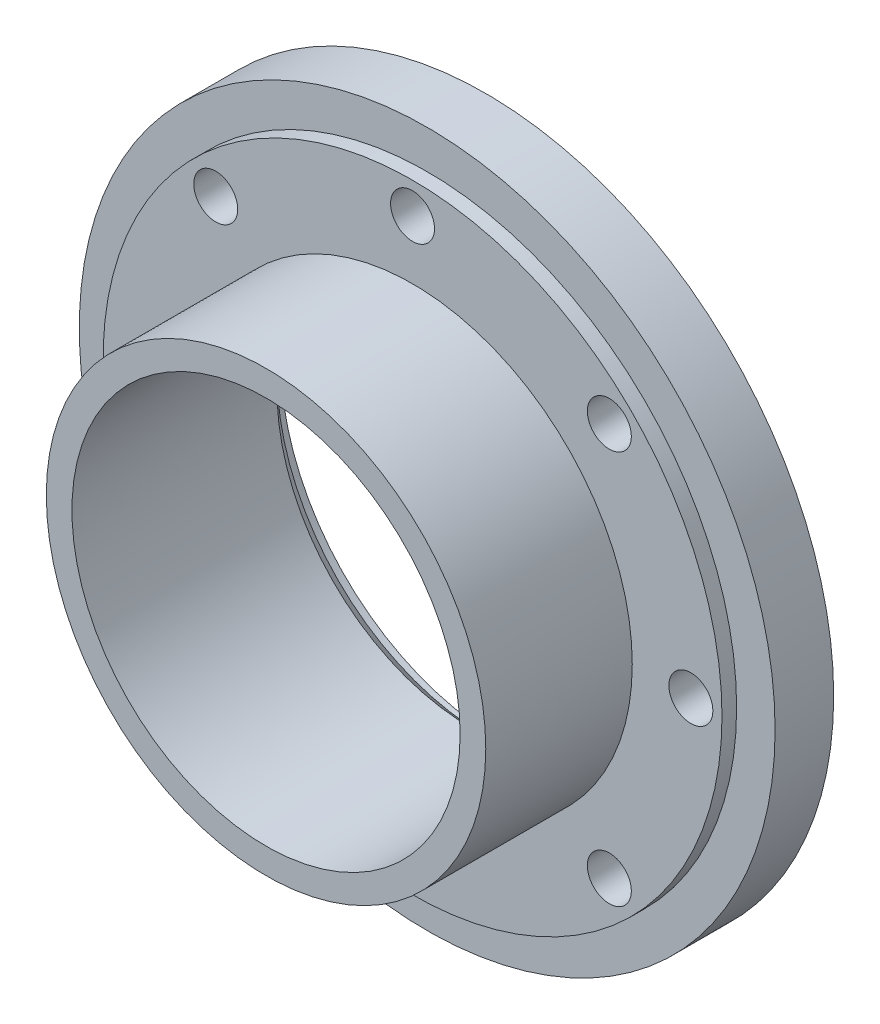
ISO-10303-21;
HEADER;
FILE_DESCRIPTION(('STEP AP214'),'2;1');
FILE_NAME('part.step','',(''),(''),'','','');
FILE_SCHEMA(('AUTOMOTIVE_DESIGN { 1 0 10303 214 1 1 1 1 }'));
ENDSEC;
DATA;
#1=APPLICATION_CONTEXT('core data for automotive mechanical design processes');
#2=APPLICATION_PROTOCOL_DEFINITION('international standard','automotive_design',2000,#1);
#3=PRODUCT_CONTEXT('',#1,'mechanical');
#4=PRODUCT('Part','Part','',(#3));
#5=PRODUCT_RELATED_PRODUCT_CATEGORY('part','',(#4));
#6=PRODUCT_DEFINITION_FORMATION('','',#4);
#7=PRODUCT_DEFINITION_CONTEXT('part definition',#1,'design');
#8=PRODUCT_DEFINITION('design','',#6,#7);
#9=PRODUCT_DEFINITION_SHAPE('','',#8);
#10=(LENGTH_UNIT() NAMED_UNIT(*) SI_UNIT(.MILLI.,.METRE.));
#11=(NAMED_UNIT(*) PLANE_ANGLE_UNIT() SI_UNIT($,.RADIAN.));
#12=(NAMED_UNIT(*) SI_UNIT($,.STERADIAN.) SOLID_ANGLE_UNIT());
#13=UNCERTAINTY_MEASURE_WITH_UNIT(LENGTH_MEASURE(1.E-05),#10,'distance_accuracy_value','');
#14=(GEOMETRIC_REPRESENTATION_CONTEXT(3) GLOBAL_UNCERTAINTY_ASSIGNED_CONTEXT((#13)) GLOBAL_UNIT_ASSIGNED_CONTEXT((#10,
#11,#12)) REPRESENTATION_CONTEXT('',''));
#15=CARTESIAN_POINT('',(0.,0.,0.));
#16=DIRECTION('',(0.,0.,1.));
#17=DIRECTION('',(1.,0.,0.));
#18=AXIS2_PLACEMENT_3D('',#15,#16,#17);
#19=CARTESIAN_POINT('',(0.,0.,10.));
#20=DIRECTION('',(0.,0.,1.));
#21=DIRECTION('',(1.,0.,0.));
#22=AXIS2_PLACEMENT_3D('',#19,#20,#21);
#23=PLANE('',#22);
#24=CARTESIAN_POINT('',(-26.8700576850888,26.8700576850888,10.));
#25=DIRECTION('',(0.,0.,1.));
#26=DIRECTION('',(1.,0.,0.));
#27=AXIS2_PLACEMENT_3D('',#24,#25,#26);
#28=CIRCLE('',#27,3.);
#29=CARTESIAN_POINT('',(-23.8700576850888,26.8700576850888,10.));
#30=VERTEX_POINT('',#29);
#31=EDGE_CURVE('E125',#30,#30,#28,.T.);
#32=ORIENTED_EDGE('',*,*,#31,.F.);
#33=EDGE_LOOP('',(#32));
#34=FACE_BOUND('',#33,.T.);
#35=CARTESIAN_POINT('',(-38.,0.,10.));
#36=DIRECTION('',(0.,0.,1.));
#37=DIRECTION('',(1.,0.,0.));
#38=AXIS2_PLACEMENT_3D('',#35,#36,#37);
#39=CIRCLE('',#38,3.);
#40=CARTESIAN_POINT('',(-35.,0.,10.));
#41=VERTEX_POINT('',#40);
#42=EDGE_CURVE('E119',#41,#41,#39,.T.);
#43=ORIENTED_EDGE('',*,*,#42,.F.);
#44=EDGE_LOOP('',(#43));
#45=FACE_BOUND('',#44,.T.);
#46=CARTESIAN_POINT('',(-26.8700576850888,-26.8700576850888,10.));
#47=DIRECTION('',(0.,0.,1.));
#48=DIRECTION('',(1.,0.,0.));
#49=AXIS2_PLACEMENT_3D('',#46,#47,#48);
#50=CIRCLE('',#49,3.);
#51=CARTESIAN_POINT('',(-23.8700576850888,-26.8700576850888,10.));
#52=VERTEX_POINT('',#51);
#53=EDGE_CURVE('E113',#52,#52,#50,.T.);
#54=ORIENTED_EDGE('',*,*,#53,.F.);
#55=EDGE_LOOP('',(#54));
#56=FACE_BOUND('',#55,.T.);
#57=CARTESIAN_POINT('',(0.,-38.,10.));
#58=DIRECTION('',(0.,0.,1.));
#59=DIRECTION('',(1.,0.,0.));
#60=AXIS2_PLACEMENT_3D('',#57,#58,#59);
#61=CIRCLE('',#60,3.);
#62=CARTESIAN_POINT('',(3.00000000000001,-38.,10.));
#63=VERTEX_POINT('',#62);
#64=EDGE_CURVE('E107',#63,#63,#61,.T.);
#65=ORIENTED_EDGE('',*,*,#64,.F.);
#66=EDGE_LOOP('',(#65));
#67=FACE_BOUND('',#66,.T.);
#68=CARTESIAN_POINT('',(26.8700576850888,-26.8700576850888,10.));
#69=DIRECTION('',(0.,0.,1.));
#70=DIRECTION('',(1.,0.,0.));
#71=AXIS2_PLACEMENT_3D('',#68,#69,#70);
#72=CIRCLE('',#71,3.);
#73=CARTESIAN_POINT('',(29.8700576850888,-26.8700576850888,10.));
#74=VERTEX_POINT('',#73);
#75=EDGE_CURVE('E101',#74,#74,#72,.T.);
#76=ORIENTED_EDGE('',*,*,#75,.F.);
#77=EDGE_LOOP('',(#76));
#78=FACE_BOUND('',#77,.T.);
#79=CARTESIAN_POINT('',(38.,0.,10.));
#80=DIRECTION('',(0.,0.,1.));
#81=DIRECTION('',(1.,0.,0.));
#82=AXIS2_PLACEMENT_3D('',#79,#80,#81);
#83=CIRCLE('',#82,3.);
#84=CARTESIAN_POINT('',(41.,0.,10.));
#85=VERTEX_POINT('',#84);
#86=EDGE_CURVE('E95',#85,#85,#83,.T.);
#87=ORIENTED_EDGE('',*,*,#86,.F.);
#88=EDGE_LOOP('',(#87));
#89=FACE_BOUND('',#88,.T.);
#90=CARTESIAN_POINT('',(26.8700576850888,26.8700576850888,10.));
#91=DIRECTION('',(0.,0.,1.));
#92=DIRECTION('',(1.,0.,0.));
#93=AXIS2_PLACEMENT_3D('',#90,#91,#92);
#94=CIRCLE('',#93,3.);
#95=CARTESIAN_POINT('',(29.8700576850888,26.8700576850888,10.));
#96=VERTEX_POINT('',#95);
#97=EDGE_CURVE('E89',#96,#96,#94,.T.);
#98=ORIENTED_EDGE('',*,*,#97,.F.);
#99=EDGE_LOOP('',(#98));
#100=FACE_BOUND('',#99,.T.);
#101=CARTESIAN_POINT('',(0.,38.,10.));
#102=DIRECTION('',(0.,0.,1.));
#103=DIRECTION('',(1.,0.,0.));
#104=AXIS2_PLACEMENT_3D('',#101,#102,#103);
#105=CIRCLE('',#104,3.);
#106=CARTESIAN_POINT('',(3.,38.,10.));
#107=VERTEX_POINT('',#106);
#108=EDGE_CURVE('E83',#107,#107,#105,.T.);
#109=ORIENTED_EDGE('',*,*,#108,.F.);
#110=EDGE_LOOP('',(#109));
#111=FACE_BOUND('',#110,.T.);
#112=CARTESIAN_POINT('',(0.,0.,10.));
#113=DIRECTION('',(0.,0.,1.));
#114=DIRECTION('',(1.,0.,0.));
#115=AXIS2_PLACEMENT_3D('',#112,#113,#114);
#116=CIRCLE('',#115,30.);
#117=CARTESIAN_POINT('',(30.,0.,10.));
#118=VERTEX_POINT('',#117);
#119=EDGE_CURVE('E56',#118,#118,#116,.T.);
#120=ORIENTED_EDGE('',*,*,#119,.F.);
#121=EDGE_LOOP('',(#120));
#122=FACE_BOUND('',#121,.T.);
#123=CARTESIAN_POINT('',(0.,0.,10.));
#124=DIRECTION('',(0.,0.,1.));
#125=DIRECTION('',(1.,0.,0.));
#126=AXIS2_PLACEMENT_3D('',#123,#124,#125);
#127=CIRCLE('',#126,42.25);
#128=CARTESIAN_POINT('',(42.25,0.,10.));
#129=VERTEX_POINT('',#128);
#130=EDGE_CURVE('E77',#129,#129,#127,.T.);
#131=ORIENTED_EDGE('',*,*,#130,.T.);
#132=EDGE_LOOP('',(#131));
#133=FACE_BOUND('',#132,.T.);
#134=ADVANCED_FACE('F35',(#34,#45,#56,#67,#78,#89,#100,#111,#122,#133),#23,.T.);
#135=CARTESIAN_POINT('',(0.,0.,10.));
#136=DIRECTION('',(0.,0.,-1.));
#137=DIRECTION('',(-1.,0.,0.));
#138=AXIS2_PLACEMENT_3D('',#135,#136,#137);
#139=CYLINDRICAL_SURFACE('',#138,47.5);
#140=CARTESIAN_POINT('',(0.,0.,0.));
#141=DIRECTION('',(0.,0.,1.));
#142=DIRECTION('',(1.,0.,0.));
#143=AXIS2_PLACEMENT_3D('',#140,#141,#142);
#144=CIRCLE('',#143,47.5);
#145=CARTESIAN_POINT('',(47.5,0.,0.));
#146=VERTEX_POINT('',#145);
#147=EDGE_CURVE('E50',#146,#146,#144,.T.);
#148=ORIENTED_EDGE('',*,*,#147,.T.);
#149=EDGE_LOOP('',(#148));
#150=FACE_BOUND('',#149,.T.);
#151=CARTESIAN_POINT('',(0.,0.,8.));
#152=DIRECTION('',(0.,0.,1.));
#153=DIRECTION('',(1.,0.,0.));
#154=AXIS2_PLACEMENT_3D('',#151,#152,#153);
#155=CIRCLE('',#154,47.5);
#156=CARTESIAN_POINT('',(47.5,0.,8.));
#157=VERTEX_POINT('',#156);
#158=EDGE_CURVE('E71',#157,#157,#155,.T.);
#159=ORIENTED_EDGE('',*,*,#158,.F.);
#160=EDGE_LOOP('',(#159));
#161=FACE_BOUND('',#160,.T.);
#162=ADVANCED_FACE('F143',(#150,#161),#139,.T.);
#163=CARTESIAN_POINT('',(0.,0.,0.));
#164=DIRECTION('',(0.,0.,1.));
#165=DIRECTION('',(1.,0.,0.));
#166=AXIS2_PLACEMENT_3D('',#163,#164,#165);
#167=PLANE('',#166);
#168=CARTESIAN_POINT('',(-26.8700576850888,26.8700576850888,0.));
#169=DIRECTION('',(0.,0.,1.));
#170=DIRECTION('',(1.,0.,0.));
#171=AXIS2_PLACEMENT_3D('',#168,#169,#170);
#172=CIRCLE('',#171,3.);
#173=CARTESIAN_POINT('',(-23.8700576850888,26.8700576850888,0.));
#174=VERTEX_POINT('',#173);
#175=EDGE_CURVE('E122',#174,#174,#172,.T.);
#176=ORIENTED_EDGE('',*,*,#175,.T.);
#177=EDGE_LOOP('',(#176));
#178=FACE_BOUND('',#177,.T.);
#179=CARTESIAN_POINT('',(-38.,0.,0.));
#180=DIRECTION('',(0.,0.,1.));
#181=DIRECTION('',(1.,0.,0.));
#182=AXIS2_PLACEMENT_3D('',#179,#180,#181);
#183=CIRCLE('',#182,3.);
#184=CARTESIAN_POINT('',(-35.,0.,0.));
#185=VERTEX_POINT('',#184);
#186=EDGE_CURVE('E116',#185,#185,#183,.T.);
#187=ORIENTED_EDGE('',*,*,#186,.T.);
#188=EDGE_LOOP('',(#187));
#189=FACE_BOUND('',#188,.T.);
#190=CARTESIAN_POINT('',(-26.8700576850888,-26.8700576850888,0.));
#191=DIRECTION('',(0.,0.,1.));
#192=DIRECTION('',(1.,0.,0.));
#193=AXIS2_PLACEMENT_3D('',#190,#191,#192);
#194=CIRCLE('',#193,3.);
#195=CARTESIAN_POINT('',(-23.8700576850888,-26.8700576850888,0.));
#196=VERTEX_POINT('',#195);
#197=EDGE_CURVE('E110',#196,#196,#194,.T.);
#198=ORIENTED_EDGE('',*,*,#197,.T.);
#199=EDGE_LOOP('',(#198));
#200=FACE_BOUND('',#199,.T.);
#201=CARTESIAN_POINT('',(0.,-38.,0.));
#202=DIRECTION('',(0.,0.,1.));
#203=DIRECTION('',(1.,0.,0.));
#204=AXIS2_PLACEMENT_3D('',#201,#202,#203);
#205=CIRCLE('',#204,3.);
#206=CARTESIAN_POINT('',(3.00000000000001,-38.,0.));
#207=VERTEX_POINT('',#206);
#208=EDGE_CURVE('E104',#207,#207,#205,.T.);
#209=ORIENTED_EDGE('',*,*,#208,.T.);
#210=EDGE_LOOP('',(#209));
#211=FACE_BOUND('',#210,.T.);
#212=CARTESIAN_POINT('',(26.8700576850888,-26.8700576850888,0.));
#213=DIRECTION('',(0.,0.,1.));
#214=DIRECTION('',(1.,0.,0.));
#215=AXIS2_PLACEMENT_3D('',#212,#213,#214);
#216=CIRCLE('',#215,3.);
#217=CARTESIAN_POINT('',(29.8700576850888,-26.8700576850888,0.));
#218=VERTEX_POINT('',#217);
#219=EDGE_CURVE('E98',#218,#218,#216,.T.);
#220=ORIENTED_EDGE('',*,*,#219,.T.);
#221=EDGE_LOOP('',(#220));
#222=FACE_BOUND('',#221,.T.);
#223=CARTESIAN_POINT('',(38.,0.,0.));
#224=DIRECTION('',(0.,0.,1.));
#225=DIRECTION('',(1.,0.,0.));
#226=AXIS2_PLACEMENT_3D('',#223,#224,#225);
#227=CIRCLE('',#226,3.);
#228=CARTESIAN_POINT('',(41.,0.,0.));
#229=VERTEX_POINT('',#228);
#230=EDGE_CURVE('E92',#229,#229,#227,.T.);
#231=ORIENTED_EDGE('',*,*,#230,.T.);
#232=EDGE_LOOP('',(#231));
#233=FACE_BOUND('',#232,.T.);
#234=CARTESIAN_POINT('',(26.8700576850888,26.8700576850888,0.));
#235=DIRECTION('',(0.,0.,1.));
#236=DIRECTION('',(1.,0.,0.));
#237=AXIS2_PLACEMENT_3D('',#234,#235,#236);
#238=CIRCLE('',#237,3.);
#239=CARTESIAN_POINT('',(29.8700576850888,26.8700576850888,0.));
#240=VERTEX_POINT('',#239);
#241=EDGE_CURVE('E86',#240,#240,#238,.T.);
#242=ORIENTED_EDGE('',*,*,#241,.T.);
#243=EDGE_LOOP('',(#242));
#244=FACE_BOUND('',#243,.T.);
#245=CARTESIAN_POINT('',(0.,38.,0.));
#246=DIRECTION('',(0.,0.,1.));
#247=DIRECTION('',(1.,0.,0.));
#248=AXIS2_PLACEMENT_3D('',#245,#246,#247);
#249=CIRCLE('',#248,3.);
#250=CARTESIAN_POINT('',(3.,38.,0.));
#251=VERTEX_POINT('',#250);
#252=EDGE_CURVE('E80',#251,#251,#249,.T.);
#253=ORIENTED_EDGE('',*,*,#252,.T.);
#254=EDGE_LOOP('',(#253));
#255=FACE_BOUND('',#254,.T.);
#256=ORIENTED_EDGE('',*,*,#147,.F.);
#257=EDGE_LOOP('',(#256));
#258=FACE_BOUND('',#257,.T.);
#259=CARTESIAN_POINT('',(0.,0.,0.));
#260=DIRECTION('',(0.,0.,1.));
#261=DIRECTION('',(1.,0.,0.));
#262=AXIS2_PLACEMENT_3D('',#259,#260,#261);
#263=CIRCLE('',#262,34.);
#264=CARTESIAN_POINT('',(34.,0.,0.));
#265=VERTEX_POINT('',#264);
#266=EDGE_CURVE('E46',#265,#265,#263,.F.);
#267=ORIENTED_EDGE('',*,*,#266,.F.);
#268=EDGE_LOOP('',(#267));
#269=FACE_BOUND('',#268,.T.);
#270=ADVANCED_FACE('F131',(#178,#189,#200,#211,#222,#233,#244,#255,#258,#269),#167,.F.);
#271=CARTESIAN_POINT('',(0.,0.,0.));
#272=DIRECTION('',(0.,0.,1.));
#273=DIRECTION('',(1.,0.,0.));
#274=AXIS2_PLACEMENT_3D('',#271,#272,#273);
#275=CIRCLE('',#274,28.5);
#276=CARTESIAN_POINT('',(28.5,0.,0.));
#277=VERTEX_POINT('',#276);
#278=EDGE_CURVE('E42',#277,#277,#275,.T.);
#279=ORIENTED_EDGE('',*,*,#278,.T.);
#280=EDGE_LOOP('',(#279));
#281=FACE_BOUND('',#280,.T.);
#282=CARTESIAN_POINT('',(0.,0.,0.));
#283=DIRECTION('',(0.,0.,-1.));
#284=DIRECTION('',(-1.,0.,0.));
#285=AXIS2_PLACEMENT_3D('',#282,#283,#284);
#286=CIRCLE('',#285,30.);
#287=CARTESIAN_POINT('',(-30.,0.,0.));
#288=VERTEX_POINT('',#287);
#289=EDGE_CURVE('E68',#288,#288,#286,.T.);
#290=ORIENTED_EDGE('',*,*,#289,.T.);
#291=EDGE_LOOP('',(#290));
#292=FACE_BOUND('',#291,.T.);
#293=ADVANCED_FACE('F201',(#281,#292),#167,.F.);
#294=CARTESIAN_POINT('',(0.,0.,30.));
#295=DIRECTION('',(0.,0.,-1.));
#296=DIRECTION('',(-1.,0.,0.));
#297=AXIS2_PLACEMENT_3D('',#294,#295,#296);
#298=CYLINDRICAL_SURFACE('',#297,30.);
#299=CARTESIAN_POINT('',(0.,0.,30.));
#300=DIRECTION('',(0.,0.,1.));
#301=DIRECTION('',(1.,0.,0.));
#302=AXIS2_PLACEMENT_3D('',#299,#300,#301);
#303=CIRCLE('',#302,30.);
#304=CARTESIAN_POINT('',(30.,0.,30.));
#305=VERTEX_POINT('',#304);
#306=EDGE_CURVE('E55',#305,#305,#303,.T.);
#307=ORIENTED_EDGE('',*,*,#306,.F.);
#308=EDGE_LOOP('',(#307));
#309=FACE_BOUND('',#308,.T.);
#310=ORIENTED_EDGE('',*,*,#119,.T.);
#311=EDGE_LOOP('',(#310));
#312=FACE_BOUND('',#311,.T.);
#313=ADVANCED_FACE('F198',(#309,#312),#298,.T.);
#314=CARTESIAN_POINT('',(0.,0.,30.));
#315=DIRECTION('',(0.,0.,1.));
#316=DIRECTION('',(1.,0.,0.));
#317=AXIS2_PLACEMENT_3D('',#314,#315,#316);
#318=PLANE('',#317);
#319=CARTESIAN_POINT('',(0.,0.,30.));
#320=DIRECTION('',(0.,0.,1.));
#321=DIRECTION('',(1.,0.,0.));
#322=AXIS2_PLACEMENT_3D('',#319,#320,#321);
#323=CIRCLE('',#322,26.5);
#324=CARTESIAN_POINT('',(26.5,0.,30.));
#325=VERTEX_POINT('',#324);
#326=EDGE_CURVE('E59',#325,#325,#323,.T.);
#327=ORIENTED_EDGE('',*,*,#326,.F.);
#328=EDGE_LOOP('',(#327));
#329=FACE_BOUND('',#328,.T.);
#330=ORIENTED_EDGE('',*,*,#306,.T.);
#331=EDGE_LOOP('',(#330));
#332=FACE_BOUND('',#331,.T.);
#333=ADVANCED_FACE('F195',(#329,#332),#318,.T.);
#334=CARTESIAN_POINT('',(0.,0.,-10.));
#335=DIRECTION('',(0.,0.,1.));
#336=DIRECTION('',(1.,0.,0.));
#337=AXIS2_PLACEMENT_3D('',#334,#335,#336);
#338=CYLINDRICAL_SURFACE('',#337,26.5);
#339=CARTESIAN_POINT('',(0.,0.,1.99999999999999));
#340=DIRECTION('',(0.,0.,1.));
#341=DIRECTION('',(1.,0.,0.));
#342=AXIS2_PLACEMENT_3D('',#339,#340,#341);
#343=CIRCLE('',#342,26.5);
#344=CARTESIAN_POINT('',(26.5,0.,1.99999999999999));
#345=VERTEX_POINT('',#344);
#346=EDGE_CURVE('E10',#345,#345,#343,.F.);
#347=ORIENTED_EDGE('',*,*,#346,.T.);
#348=EDGE_LOOP('',(#347));
#349=FACE_BOUND('',#348,.T.);
#350=ORIENTED_EDGE('',*,*,#326,.T.);
#351=EDGE_LOOP('',(#350));
#352=FACE_BOUND('',#351,.T.);
#353=ADVANCED_FACE('F188',(#349,#352),#338,.F.);
#354=CARTESIAN_POINT('',(0.,0.,-2.));
#355=DIRECTION('',(0.,0.,-1.));
#356=DIRECTION('',(-1.,0.,0.));
#357=AXIS2_PLACEMENT_3D('',#354,#355,#356);
#358=PLANE('',#357);
#359=CARTESIAN_POINT('',(0.,0.,-2.));
#360=DIRECTION('',(0.,0.,-1.));
#361=DIRECTION('',(-1.,0.,0.));
#362=AXIS2_PLACEMENT_3D('',#359,#360,#361);
#363=CIRCLE('',#362,34.);
#364=CARTESIAN_POINT('',(-34.,0.,-2.));
#365=VERTEX_POINT('',#364);
#366=EDGE_CURVE('E64',#365,#365,#363,.T.);
#367=ORIENTED_EDGE('',*,*,#366,.T.);
#368=EDGE_LOOP('',(#367));
#369=FACE_BOUND('',#368,.T.);
#370=CARTESIAN_POINT('',(0.,0.,-2.));
#371=DIRECTION('',(0.,0.,-1.));
#372=DIRECTION('',(-1.,0.,0.));
#373=AXIS2_PLACEMENT_3D('',#370,#371,#372);
#374=CIRCLE('',#373,30.);
#375=CARTESIAN_POINT('',(-30.,0.,-2.));
#376=VERTEX_POINT('',#375);
#377=EDGE_CURVE('E67',#376,#376,#374,.T.);
#378=ORIENTED_EDGE('',*,*,#377,.F.);
#379=EDGE_LOOP('',(#378));
#380=FACE_BOUND('',#379,.T.);
#381=ADVANCED_FACE('F185',(#369,#380),#358,.T.);
#382=CARTESIAN_POINT('',(0.,0.,-2.));
#383=DIRECTION('',(0.,0.,1.));
#384=DIRECTION('',(1.,0.,0.));
#385=AXIS2_PLACEMENT_3D('',#382,#383,#384);
#386=CYLINDRICAL_SURFACE('',#385,34.);
#387=ORIENTED_EDGE('',*,*,#366,.F.);
#388=EDGE_LOOP('',(#387));
#389=FACE_BOUND('',#388,.T.);
#390=ORIENTED_EDGE('',*,*,#266,.T.);
#391=EDGE_LOOP('',(#390));
#392=FACE_BOUND('',#391,.T.);
#393=ADVANCED_FACE('F183',(#389,#392),#386,.T.);
#394=CARTESIAN_POINT('',(0.,0.,-2.));
#395=DIRECTION('',(0.,0.,1.));
#396=DIRECTION('',(1.,0.,0.));
#397=AXIS2_PLACEMENT_3D('',#394,#395,#396);
#398=CYLINDRICAL_SURFACE('',#397,30.);
#399=ORIENTED_EDGE('',*,*,#377,.T.);
#400=EDGE_LOOP('',(#399));
#401=FACE_BOUND('',#400,.T.);
#402=ORIENTED_EDGE('',*,*,#289,.F.);
#403=EDGE_LOOP('',(#402));
#404=FACE_BOUND('',#403,.T.);
#405=ADVANCED_FACE('F176',(#401,#404),#398,.F.);
#406=CARTESIAN_POINT('',(0.,0.,8.));
#407=DIRECTION('',(0.,0.,1.));
#408=DIRECTION('',(1.,0.,0.));
#409=AXIS2_PLACEMENT_3D('',#406,#407,#408);
#410=PLANE('',#409);
#411=CARTESIAN_POINT('',(0.,0.,8.));
#412=DIRECTION('',(0.,0.,1.));
#413=DIRECTION('',(1.,0.,0.));
#414=AXIS2_PLACEMENT_3D('',#411,#412,#413);
#415=CIRCLE('',#414,42.25);
#416=CARTESIAN_POINT('',(42.25,0.,8.));
#417=VERTEX_POINT('',#416);
#418=EDGE_CURVE('E76',#417,#417,#415,.T.);
#419=ORIENTED_EDGE('',*,*,#418,.F.);
#420=EDGE_LOOP('',(#419));
#421=FACE_BOUND('',#420,.T.);
#422=ORIENTED_EDGE('',*,*,#158,.T.);
#423=EDGE_LOOP('',(#422));
#424=FACE_BOUND('',#423,.T.);
#425=ADVANCED_FACE('F166',(#421,#424),#410,.T.);
#426=CARTESIAN_POINT('',(0.,0.,8.));
#427=DIRECTION('',(0.,0.,1.));
#428=DIRECTION('',(1.,0.,0.));
#429=AXIS2_PLACEMENT_3D('',#426,#427,#428);
#430=CYLINDRICAL_SURFACE('',#429,42.25);
#431=ORIENTED_EDGE('',*,*,#418,.T.);
#432=EDGE_LOOP('',(#431));
#433=FACE_BOUND('',#432,.T.);
#434=ORIENTED_EDGE('',*,*,#130,.F.);
#435=EDGE_LOOP('',(#434));
#436=FACE_BOUND('',#435,.T.);
#437=ADVANCED_FACE('F163',(#433,#436),#430,.T.);
#438=CARTESIAN_POINT('',(0.,38.,0.));
#439=DIRECTION('',(0.,0.,1.));
#440=DIRECTION('',(1.,0.,0.));
#441=AXIS2_PLACEMENT_3D('',#438,#439,#440);
#442=CYLINDRICAL_SURFACE('',#441,3.);
#443=ORIENTED_EDGE('',*,*,#252,.F.);
#444=EDGE_LOOP('',(#443));
#445=FACE_BOUND('',#444,.T.);
#446=ORIENTED_EDGE('',*,*,#108,.T.);
#447=EDGE_LOOP('',(#446));
#448=FACE_BOUND('',#447,.T.);
#449=ADVANCED_FACE('F165',(#445,#448),#442,.F.);
#450=CARTESIAN_POINT('',(26.8700576850888,26.8700576850888,0.));
#451=DIRECTION('',(0.,0.,1.));
#452=DIRECTION('',(1.,0.,0.));
#453=AXIS2_PLACEMENT_3D('',#450,#451,#452);
#454=CYLINDRICAL_SURFACE('',#453,3.);
#455=ORIENTED_EDGE('',*,*,#241,.F.);
#456=EDGE_LOOP('',(#455));
#457=FACE_BOUND('',#456,.T.);
#458=ORIENTED_EDGE('',*,*,#97,.T.);
#459=EDGE_LOOP('',(#458));
#460=FACE_BOUND('',#459,.T.);
#461=ADVANCED_FACE('F173',(#457,#460),#454,.F.);
#462=CARTESIAN_POINT('',(38.,0.,0.));
#463=DIRECTION('',(0.,0.,1.));
#464=DIRECTION('',(1.,0.,0.));
#465=AXIS2_PLACEMENT_3D('',#462,#463,#464);
#466=CYLINDRICAL_SURFACE('',#465,3.);
#467=ORIENTED_EDGE('',*,*,#230,.F.);
#468=EDGE_LOOP('',(#467));
#469=FACE_BOUND('',#468,.T.);
#470=ORIENTED_EDGE('',*,*,#86,.T.);
#471=EDGE_LOOP('',(#470));
#472=FACE_BOUND('',#471,.T.);
#473=ADVANCED_FACE('F299',(#469,#472),#466,.F.);
#474=CARTESIAN_POINT('',(26.8700576850888,-26.8700576850888,0.));
#475=DIRECTION('',(0.,0.,1.));
#476=DIRECTION('',(1.,0.,0.));
#477=AXIS2_PLACEMENT_3D('',#474,#475,#476);
#478=CYLINDRICAL_SURFACE('',#477,3.);
#479=ORIENTED_EDGE('',*,*,#219,.F.);
#480=EDGE_LOOP('',(#479));
#481=FACE_BOUND('',#480,.T.);
#482=ORIENTED_EDGE('',*,*,#75,.T.);
#483=EDGE_LOOP('',(#482));
#484=FACE_BOUND('',#483,.T.);
#485=ADVANCED_FACE('F307',(#481,#484),#478,.F.);
#486=CARTESIAN_POINT('',(0.,-38.,0.));
#487=DIRECTION('',(0.,0.,1.));
#488=DIRECTION('',(1.,0.,0.));
#489=AXIS2_PLACEMENT_3D('',#486,#487,#488);
#490=CYLINDRICAL_SURFACE('',#489,3.);
#491=ORIENTED_EDGE('',*,*,#208,.F.);
#492=EDGE_LOOP('',(#491));
#493=FACE_BOUND('',#492,.T.);
#494=ORIENTED_EDGE('',*,*,#64,.T.);
#495=EDGE_LOOP('',(#494));
#496=FACE_BOUND('',#495,.T.);
#497=ADVANCED_FACE('F316',(#493,#496),#490,.F.);
#498=CARTESIAN_POINT('',(-26.8700576850888,-26.8700576850888,0.));
#499=DIRECTION('',(0.,0.,1.));
#500=DIRECTION('',(1.,0.,0.));
#501=AXIS2_PLACEMENT_3D('',#498,#499,#500);
#502=CYLINDRICAL_SURFACE('',#501,3.);
#503=ORIENTED_EDGE('',*,*,#197,.F.);
#504=EDGE_LOOP('',(#503));
#505=FACE_BOUND('',#504,.T.);
#506=ORIENTED_EDGE('',*,*,#53,.T.);
#507=EDGE_LOOP('',(#506));
#508=FACE_BOUND('',#507,.T.);
#509=ADVANCED_FACE('F325',(#505,#508),#502,.F.);
#510=CARTESIAN_POINT('',(-38.,0.,0.));
#511=DIRECTION('',(0.,0.,1.));
#512=DIRECTION('',(1.,0.,0.));
#513=AXIS2_PLACEMENT_3D('',#510,#511,#512);
#514=CYLINDRICAL_SURFACE('',#513,3.);
#515=ORIENTED_EDGE('',*,*,#186,.F.);
#516=EDGE_LOOP('',(#515));
#517=FACE_BOUND('',#516,.T.);
#518=ORIENTED_EDGE('',*,*,#42,.T.);
#519=EDGE_LOOP('',(#518));
#520=FACE_BOUND('',#519,.T.);
#521=ADVANCED_FACE('F137',(#517,#520),#514,.F.);
#522=CARTESIAN_POINT('',(-26.8700576850888,26.8700576850888,0.));
#523=DIRECTION('',(0.,0.,1.));
#524=DIRECTION('',(1.,0.,0.));
#525=AXIS2_PLACEMENT_3D('',#522,#523,#524);
#526=CYLINDRICAL_SURFACE('',#525,3.);
#527=ORIENTED_EDGE('',*,*,#175,.F.);
#528=EDGE_LOOP('',(#527));
#529=FACE_BOUND('',#528,.T.);
#530=ORIENTED_EDGE('',*,*,#31,.T.);
#531=EDGE_LOOP('',(#530));
#532=FACE_BOUND('',#531,.T.);
#533=ADVANCED_FACE('F134',(#529,#532),#526,.F.);
#534=CARTESIAN_POINT('',(0.,0.,0.));
#535=DIRECTION('',(0.,0.,-1.));
#536=DIRECTION('',(-1.,0.,0.));
#537=AXIS2_PLACEMENT_3D('',#534,#535,#536);
#538=CONICAL_SURFACE('',#537,28.5,0.785398163397447);
#539=ORIENTED_EDGE('',*,*,#346,.F.);
#540=EDGE_LOOP('',(#539));
#541=FACE_BOUND('',#540,.T.);
#542=ORIENTED_EDGE('',*,*,#278,.F.);
#543=EDGE_LOOP('',(#542));
#544=FACE_BOUND('',#543,.T.);
#545=ADVANCED_FACE('F37',(#541,#544),#538,.F.);
#546=CLOSED_SHELL('',(#134,#162,#270,#293,#313,#333,#353,#381,#393,#405,#425,#437,#449,#461,
#473,#485,#497,#509,#521,#533,#545));
#547=MANIFOLD_SOLID_BREP('B2',#546);
#548=ADVANCED_BREP_SHAPE_REPRESENTATION('',(#18,#547),#14);
#549=SHAPE_DEFINITION_REPRESENTATION(#9,#548);
ENDSEC;
END-ISO-10303-21;
